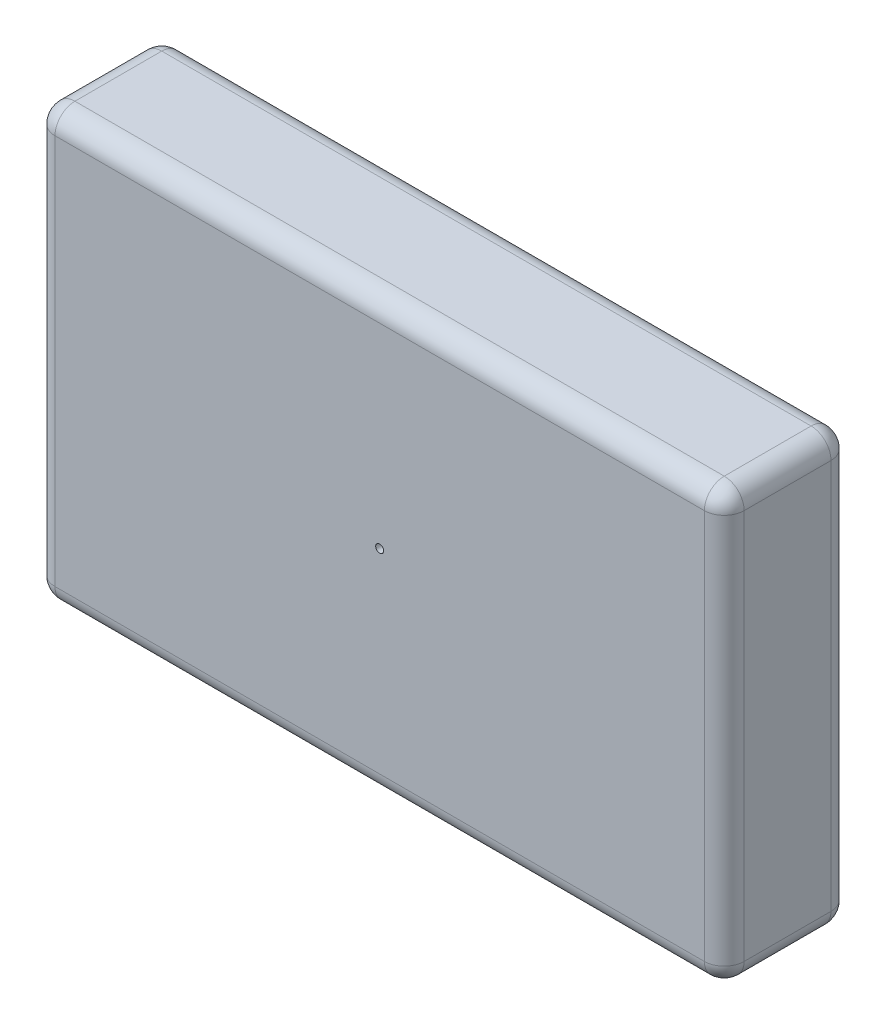
ISO-10303-21;
HEADER;
FILE_DESCRIPTION(('STEP AP214'),'2;1');
FILE_NAME('part.step','',(''),(''),'','','');
FILE_SCHEMA(('AUTOMOTIVE_DESIGN { 1 0 10303 214 1 1 1 1 }'));
ENDSEC;
DATA;
#1=APPLICATION_CONTEXT('core data for automotive mechanical design processes');
#2=APPLICATION_PROTOCOL_DEFINITION('international standard','automotive_design',2000,#1);
#3=PRODUCT_CONTEXT('',#1,'mechanical');
#4=PRODUCT('Part','Part','',(#3));
#5=PRODUCT_RELATED_PRODUCT_CATEGORY('part','',(#4));
#6=PRODUCT_DEFINITION_FORMATION('','',#4);
#7=PRODUCT_DEFINITION_CONTEXT('part definition',#1,'design');
#8=PRODUCT_DEFINITION('design','',#6,#7);
#9=PRODUCT_DEFINITION_SHAPE('','',#8);
#10=(LENGTH_UNIT() NAMED_UNIT(*) SI_UNIT(.MILLI.,.METRE.));
#11=(NAMED_UNIT(*) PLANE_ANGLE_UNIT() SI_UNIT($,.RADIAN.));
#12=(NAMED_UNIT(*) SI_UNIT($,.STERADIAN.) SOLID_ANGLE_UNIT());
#13=UNCERTAINTY_MEASURE_WITH_UNIT(LENGTH_MEASURE(1.E-05),#10,'distance_accuracy_value','');
#14=(GEOMETRIC_REPRESENTATION_CONTEXT(3) GLOBAL_UNCERTAINTY_ASSIGNED_CONTEXT((#13)) GLOBAL_UNIT_ASSIGNED_CONTEXT((#10,
#11,#12)) REPRESENTATION_CONTEXT('',''));
#15=CARTESIAN_POINT('',(0.,0.,0.));
#16=DIRECTION('',(0.,0.,1.));
#17=DIRECTION('',(1.,0.,0.));
#18=AXIS2_PLACEMENT_3D('',#15,#16,#17);
#19=CARTESIAN_POINT('',(86.5,54.,31.8));
#20=DIRECTION('',(-1.,0.,0.));
#21=DIRECTION('',(0.,0.,1.));
#22=AXIS2_PLACEMENT_3D('',#19,#20,#21);
#23=PLANE('',#22);
#24=DIRECTION('',(0.,1.,0.));
#25=VECTOR('',#24,1.);
#26=CARTESIAN_POINT('',(86.5,-54.,26.8));
#27=LINE('',#26,#25);
#28=CARTESIAN_POINT('',(86.5,49.,26.8));
#29=VERTEX_POINT('',#28);
#30=CARTESIAN_POINT('',(86.5,-49.,26.8));
#31=VERTEX_POINT('',#30);
#32=EDGE_CURVE('E181',#29,#31,#27,.F.);
#33=ORIENTED_EDGE('',*,*,#32,.T.);
#34=DIRECTION('',(0.,0.,-1.));
#35=VECTOR('',#34,1.);
#36=CARTESIAN_POINT('',(86.5,-49.,31.8));
#37=LINE('',#36,#35);
#38=CARTESIAN_POINT('',(86.5,-49.,5.));
#39=VERTEX_POINT('',#38);
#40=EDGE_CURVE('E240',#31,#39,#37,.T.);
#41=ORIENTED_EDGE('',*,*,#40,.T.);
#42=DIRECTION('',(0.,1.,0.));
#43=VECTOR('',#42,1.);
#44=CARTESIAN_POINT('',(86.5,54.,5.));
#45=LINE('',#44,#43);
#46=CARTESIAN_POINT('',(86.5,49.,5.));
#47=VERTEX_POINT('',#46);
#48=EDGE_CURVE('E154',#39,#47,#45,.T.);
#49=ORIENTED_EDGE('',*,*,#48,.T.);
#50=DIRECTION('',(0.,0.,-1.));
#51=VECTOR('',#50,1.);
#52=CARTESIAN_POINT('',(86.5,49.,31.8));
#53=LINE('',#52,#51);
#54=EDGE_CURVE('E238',#47,#29,#53,.F.);
#55=ORIENTED_EDGE('',*,*,#54,.T.);
#56=EDGE_LOOP('',(#33,#41,#49,#55));
#57=FACE_BOUND('',#56,.T.);
#58=ADVANCED_FACE('F39',(#57),#23,.F.);
#59=CARTESIAN_POINT('',(-86.5,54.,31.8));
#60=DIRECTION('',(0.,-1.,0.));
#61=DIRECTION('',(0.,0.,-1.));
#62=AXIS2_PLACEMENT_3D('',#59,#60,#61);
#63=PLANE('',#62);
#64=DIRECTION('',(-1.,0.,0.));
#65=VECTOR('',#64,1.);
#66=CARTESIAN_POINT('',(-86.5,54.,5.));
#67=LINE('',#66,#65);
#68=CARTESIAN_POINT('',(81.5,54.,5.));
#69=VERTEX_POINT('',#68);
#70=CARTESIAN_POINT('',(-81.5,54.,5.));
#71=VERTEX_POINT('',#70);
#72=EDGE_CURVE('E183',#69,#71,#67,.T.);
#73=ORIENTED_EDGE('',*,*,#72,.T.);
#74=DIRECTION('',(0.,0.,-1.));
#75=VECTOR('',#74,1.);
#76=CARTESIAN_POINT('',(-81.5,54.,31.8));
#77=LINE('',#76,#75);
#78=CARTESIAN_POINT('',(-81.5,54.,26.8));
#79=VERTEX_POINT('',#78);
#80=EDGE_CURVE('E11',#71,#79,#77,.F.);
#81=ORIENTED_EDGE('',*,*,#80,.T.);
#82=DIRECTION('',(-1.,0.,0.));
#83=VECTOR('',#82,1.);
#84=CARTESIAN_POINT('',(86.5,54.,26.8));
#85=LINE('',#84,#83);
#86=CARTESIAN_POINT('',(81.5,54.,26.8));
#87=VERTEX_POINT('',#86);
#88=EDGE_CURVE('E179',#79,#87,#85,.F.);
#89=ORIENTED_EDGE('',*,*,#88,.T.);
#90=DIRECTION('',(0.,0.,-1.));
#91=VECTOR('',#90,1.);
#92=CARTESIAN_POINT('',(81.5,54.,31.8));
#93=LINE('',#92,#91);
#94=EDGE_CURVE('E48',#87,#69,#93,.T.);
#95=ORIENTED_EDGE('',*,*,#94,.T.);
#96=EDGE_LOOP('',(#73,#81,#89,#95));
#97=FACE_BOUND('',#96,.T.);
#98=ADVANCED_FACE('F295',(#97),#63,.F.);
#99=CARTESIAN_POINT('',(-86.5,54.,31.8));
#100=DIRECTION('',(1.,0.,0.));
#101=DIRECTION('',(0.,1.,0.));
#102=AXIS2_PLACEMENT_3D('',#99,#100,#101);
#103=PLANE('',#102);
#104=DIRECTION('',(0.,-1.,0.));
#105=VECTOR('',#104,1.);
#106=CARTESIAN_POINT('',(-86.5,54.,5.));
#107=LINE('',#106,#105);
#108=CARTESIAN_POINT('',(-86.5,49.,5.));
#109=VERTEX_POINT('',#108);
#110=CARTESIAN_POINT('',(-86.5,-49.,5.));
#111=VERTEX_POINT('',#110);
#112=EDGE_CURVE('E197',#109,#111,#107,.T.);
#113=ORIENTED_EDGE('',*,*,#112,.T.);
#114=DIRECTION('',(0.,0.,-1.));
#115=VECTOR('',#114,1.);
#116=CARTESIAN_POINT('',(-86.5,-49.,31.8));
#117=LINE('',#116,#115);
#118=CARTESIAN_POINT('',(-86.5,-49.,26.8));
#119=VERTEX_POINT('',#118);
#120=EDGE_CURVE('E236',#111,#119,#117,.F.);
#121=ORIENTED_EDGE('',*,*,#120,.T.);
#122=DIRECTION('',(0.,-1.,0.));
#123=VECTOR('',#122,1.);
#124=CARTESIAN_POINT('',(-86.5,54.,26.8));
#125=LINE('',#124,#123);
#126=CARTESIAN_POINT('',(-86.5,49.,26.8));
#127=VERTEX_POINT('',#126);
#128=EDGE_CURVE('E172',#119,#127,#125,.F.);
#129=ORIENTED_EDGE('',*,*,#128,.T.);
#130=DIRECTION('',(0.,0.,-1.));
#131=VECTOR('',#130,1.);
#132=CARTESIAN_POINT('',(-86.5,49.,31.8));
#133=LINE('',#132,#131);
#134=EDGE_CURVE('E234',#127,#109,#133,.T.);
#135=ORIENTED_EDGE('',*,*,#134,.T.);
#136=EDGE_LOOP('',(#113,#121,#129,#135));
#137=FACE_BOUND('',#136,.T.);
#138=ADVANCED_FACE('F285',(#137),#103,.F.);
#139=CARTESIAN_POINT('',(-86.5,-54.,31.8));
#140=DIRECTION('',(0.,1.,0.));
#141=DIRECTION('',(0.,0.,1.));
#142=AXIS2_PLACEMENT_3D('',#139,#140,#141);
#143=PLANE('',#142);
#144=DIRECTION('',(1.,0.,0.));
#145=VECTOR('',#144,1.);
#146=CARTESIAN_POINT('',(-86.5,-54.,26.8));
#147=LINE('',#146,#145);
#148=CARTESIAN_POINT('',(81.5,-54.,26.8));
#149=VERTEX_POINT('',#148);
#150=CARTESIAN_POINT('',(-81.5,-54.,26.8));
#151=VERTEX_POINT('',#150);
#152=EDGE_CURVE('E152',#149,#151,#147,.F.);
#153=ORIENTED_EDGE('',*,*,#152,.T.);
#154=DIRECTION('',(0.,0.,-1.));
#155=VECTOR('',#154,1.);
#156=CARTESIAN_POINT('',(-81.5,-54.,31.8));
#157=LINE('',#156,#155);
#158=CARTESIAN_POINT('',(-81.5,-54.,5.));
#159=VERTEX_POINT('',#158);
#160=EDGE_CURVE('E232',#151,#159,#157,.T.);
#161=ORIENTED_EDGE('',*,*,#160,.T.);
#162=DIRECTION('',(1.,0.,0.));
#163=VECTOR('',#162,1.);
#164=CARTESIAN_POINT('',(-86.5,-54.,5.));
#165=LINE('',#164,#163);
#166=CARTESIAN_POINT('',(81.5,-54.,5.));
#167=VERTEX_POINT('',#166);
#168=EDGE_CURVE('E200',#159,#167,#165,.T.);
#169=ORIENTED_EDGE('',*,*,#168,.T.);
#170=DIRECTION('',(0.,0.,-1.));
#171=VECTOR('',#170,1.);
#172=CARTESIAN_POINT('',(81.5,-54.,31.8));
#173=LINE('',#172,#171);
#174=EDGE_CURVE('E230',#167,#149,#173,.F.);
#175=ORIENTED_EDGE('',*,*,#174,.T.);
#176=EDGE_LOOP('',(#153,#161,#169,#175));
#177=FACE_BOUND('',#176,.T.);
#178=ADVANCED_FACE('F412',(#177),#143,.F.);
#179=CARTESIAN_POINT('',(0.,0.,31.8));
#180=DIRECTION('',(0.,0.,1.));
#181=DIRECTION('',(1.,0.,0.));
#182=AXIS2_PLACEMENT_3D('',#179,#180,#181);
#183=PLANE('',#182);
#184=CARTESIAN_POINT('',(0.,0.,31.8));
#185=DIRECTION('',(0.,0.,1.));
#186=DIRECTION('',(1.,0.,0.));
#187=AXIS2_PLACEMENT_3D('',#184,#185,#186);
#188=CIRCLE('',#187,1.);
#189=CARTESIAN_POINT('',(1.,0.,31.8));
#190=VERTEX_POINT('',#189);
#191=EDGE_CURVE('E262',#190,#190,#188,.T.);
#192=ORIENTED_EDGE('',*,*,#191,.F.);
#193=EDGE_LOOP('',(#192));
#194=FACE_BOUND('',#193,.T.);
#195=DIRECTION('',(0.,-1.,0.));
#196=VECTOR('',#195,1.);
#197=CARTESIAN_POINT('',(-81.5,-54.,31.8));
#198=LINE('',#197,#196);
#199=CARTESIAN_POINT('',(-81.5,49.,31.8));
#200=VERTEX_POINT('',#199);
#201=CARTESIAN_POINT('',(-81.5,-49.,31.8));
#202=VERTEX_POINT('',#201);
#203=EDGE_CURVE('E170',#200,#202,#198,.T.);
#204=ORIENTED_EDGE('',*,*,#203,.T.);
#205=DIRECTION('',(1.,0.,0.));
#206=VECTOR('',#205,1.);
#207=CARTESIAN_POINT('',(86.5,-49.,31.8));
#208=LINE('',#207,#206);
#209=CARTESIAN_POINT('',(81.5,-49.,31.8));
#210=VERTEX_POINT('',#209);
#211=EDGE_CURVE('E149',#202,#210,#208,.T.);
#212=ORIENTED_EDGE('',*,*,#211,.T.);
#213=DIRECTION('',(0.,1.,0.));
#214=VECTOR('',#213,1.);
#215=CARTESIAN_POINT('',(81.5,54.,31.8));
#216=LINE('',#215,#214);
#217=CARTESIAN_POINT('',(81.5,49.,31.8));
#218=VERTEX_POINT('',#217);
#219=EDGE_CURVE('E158',#210,#218,#216,.T.);
#220=ORIENTED_EDGE('',*,*,#219,.T.);
#221=DIRECTION('',(-1.,0.,0.));
#222=VECTOR('',#221,1.);
#223=CARTESIAN_POINT('',(-86.5,49.,31.8));
#224=LINE('',#223,#222);
#225=EDGE_CURVE('E164',#218,#200,#224,.T.);
#226=ORIENTED_EDGE('',*,*,#225,.T.);
#227=EDGE_LOOP('',(#204,#212,#220,#226));
#228=FACE_BOUND('',#227,.T.);
#229=ADVANCED_FACE('F168',(#194,#228),#183,.T.);
#230=CARTESIAN_POINT('',(0.,0.,0.));
#231=DIRECTION('',(0.,0.,1.));
#232=DIRECTION('',(1.,0.,0.));
#233=AXIS2_PLACEMENT_3D('',#230,#231,#232);
#234=PLANE('',#233);
#235=DIRECTION('',(0.,-1.,0.));
#236=VECTOR('',#235,1.);
#237=CARTESIAN_POINT('',(-81.5,0.,0.));
#238=LINE('',#237,#236);
#239=CARTESIAN_POINT('',(-81.5,-49.,0.));
#240=VERTEX_POINT('',#239);
#241=CARTESIAN_POINT('',(-81.5,49.,0.));
#242=VERTEX_POINT('',#241);
#243=EDGE_CURVE('E191',#240,#242,#238,.F.);
#244=ORIENTED_EDGE('',*,*,#243,.T.);
#245=DIRECTION('',(-1.,0.,0.));
#246=VECTOR('',#245,1.);
#247=CARTESIAN_POINT('',(0.,49.,0.));
#248=LINE('',#247,#246);
#249=CARTESIAN_POINT('',(81.5,49.,0.));
#250=VERTEX_POINT('',#249);
#251=EDGE_CURVE('E194',#242,#250,#248,.F.);
#252=ORIENTED_EDGE('',*,*,#251,.T.);
#253=DIRECTION('',(0.,1.,0.));
#254=VECTOR('',#253,1.);
#255=CARTESIAN_POINT('',(81.5,0.,0.));
#256=LINE('',#255,#254);
#257=CARTESIAN_POINT('',(81.5,-49.,0.));
#258=VERTEX_POINT('',#257);
#259=EDGE_CURVE('E185',#250,#258,#256,.F.);
#260=ORIENTED_EDGE('',*,*,#259,.T.);
#261=DIRECTION('',(1.,0.,0.));
#262=VECTOR('',#261,1.);
#263=CARTESIAN_POINT('',(0.,-49.,0.));
#264=LINE('',#263,#262);
#265=EDGE_CURVE('E188',#258,#240,#264,.F.);
#266=ORIENTED_EDGE('',*,*,#265,.T.);
#267=EDGE_LOOP('',(#244,#252,#260,#266));
#268=FACE_BOUND('',#267,.T.);
#269=ADVANCED_FACE('F330',(#268),#234,.F.);
#270=CARTESIAN_POINT('',(0.,49.,26.8));
#271=DIRECTION('',(1.,0.,0.));
#272=DIRECTION('',(0.,0.,-1.));
#273=AXIS2_PLACEMENT_3D('',#270,#271,#272);
#274=CYLINDRICAL_SURFACE('',#273,5.);
#275=ORIENTED_EDGE('',*,*,#88,.F.);
#276=CARTESIAN_POINT('',(-81.5,49.,26.8));
#277=DIRECTION('',(1.,0.,0.));
#278=DIRECTION('',(0.,0.,-1.));
#279=AXIS2_PLACEMENT_3D('',#276,#277,#278);
#280=CIRCLE('',#279,5.);
#281=EDGE_CURVE('E225',#79,#200,#280,.T.);
#282=ORIENTED_EDGE('',*,*,#281,.T.);
#283=ORIENTED_EDGE('',*,*,#225,.F.);
#284=CARTESIAN_POINT('',(81.5,49.,26.8));
#285=DIRECTION('',(1.,0.,0.));
#286=DIRECTION('',(0.,0.,-1.));
#287=AXIS2_PLACEMENT_3D('',#284,#285,#286);
#288=CIRCLE('',#287,5.);
#289=EDGE_CURVE('E223',#218,#87,#288,.F.);
#290=ORIENTED_EDGE('',*,*,#289,.T.);
#291=EDGE_LOOP('',(#275,#282,#283,#290));
#292=FACE_BOUND('',#291,.T.);
#293=ADVANCED_FACE('F296',(#292),#274,.T.);
#294=CARTESIAN_POINT('',(-81.5,0.,26.8));
#295=DIRECTION('',(0.,1.,0.));
#296=DIRECTION('',(-1.,0.,0.));
#297=AXIS2_PLACEMENT_3D('',#294,#295,#296);
#298=CYLINDRICAL_SURFACE('',#297,5.);
#299=ORIENTED_EDGE('',*,*,#128,.F.);
#300=CARTESIAN_POINT('',(-81.5,-49.,26.8));
#301=DIRECTION('',(0.,1.,0.));
#302=DIRECTION('',(-1.,0.,0.));
#303=AXIS2_PLACEMENT_3D('',#300,#301,#302);
#304=CIRCLE('',#303,5.);
#305=EDGE_CURVE('E209',#119,#202,#304,.T.);
#306=ORIENTED_EDGE('',*,*,#305,.T.);
#307=ORIENTED_EDGE('',*,*,#203,.F.);
#308=CARTESIAN_POINT('',(-81.5,49.,26.8));
#309=DIRECTION('',(0.,1.,0.));
#310=DIRECTION('',(-1.,0.,0.));
#311=AXIS2_PLACEMENT_3D('',#308,#309,#310);
#312=CIRCLE('',#311,5.);
#313=EDGE_CURVE('E206',#200,#127,#312,.F.);
#314=ORIENTED_EDGE('',*,*,#313,.T.);
#315=EDGE_LOOP('',(#299,#306,#307,#314));
#316=FACE_BOUND('',#315,.T.);
#317=ADVANCED_FACE('F272',(#316),#298,.T.);
#318=CARTESIAN_POINT('',(81.5,0.,26.8));
#319=DIRECTION('',(0.,-1.,0.));
#320=DIRECTION('',(0.,0.,-1.));
#321=AXIS2_PLACEMENT_3D('',#318,#319,#320);
#322=CYLINDRICAL_SURFACE('',#321,5.);
#323=ORIENTED_EDGE('',*,*,#219,.F.);
#324=CARTESIAN_POINT('',(81.5,-49.,26.8));
#325=DIRECTION('',(0.,-1.,0.));
#326=DIRECTION('',(0.,0.,-1.));
#327=AXIS2_PLACEMENT_3D('',#324,#325,#326);
#328=CIRCLE('',#327,5.);
#329=EDGE_CURVE('E130',#210,#31,#328,.F.);
#330=ORIENTED_EDGE('',*,*,#329,.T.);
#331=ORIENTED_EDGE('',*,*,#32,.F.);
#332=CARTESIAN_POINT('',(81.5,49.,26.8));
#333=DIRECTION('',(0.,-1.,0.));
#334=DIRECTION('',(0.,0.,-1.));
#335=AXIS2_PLACEMENT_3D('',#332,#333,#334);
#336=CIRCLE('',#335,5.);
#337=EDGE_CURVE('E141',#29,#218,#336,.T.);
#338=ORIENTED_EDGE('',*,*,#337,.T.);
#339=EDGE_LOOP('',(#323,#330,#331,#338));
#340=FACE_BOUND('',#339,.T.);
#341=ADVANCED_FACE('F159',(#340),#322,.T.);
#342=CARTESIAN_POINT('',(0.,-49.,26.8));
#343=DIRECTION('',(-1.,0.,0.));
#344=DIRECTION('',(0.,0.,1.));
#345=AXIS2_PLACEMENT_3D('',#342,#343,#344);
#346=CYLINDRICAL_SURFACE('',#345,5.);
#347=ORIENTED_EDGE('',*,*,#211,.F.);
#348=CARTESIAN_POINT('',(-81.5,-49.,26.8));
#349=DIRECTION('',(-1.,0.,0.));
#350=DIRECTION('',(0.,0.,1.));
#351=AXIS2_PLACEMENT_3D('',#348,#349,#350);
#352=CIRCLE('',#351,5.);
#353=EDGE_CURVE('E153',#202,#151,#352,.F.);
#354=ORIENTED_EDGE('',*,*,#353,.T.);
#355=ORIENTED_EDGE('',*,*,#152,.F.);
#356=CARTESIAN_POINT('',(81.5,-49.,26.8));
#357=DIRECTION('',(-1.,0.,0.));
#358=DIRECTION('',(0.,0.,1.));
#359=AXIS2_PLACEMENT_3D('',#356,#357,#358);
#360=CIRCLE('',#359,5.);
#361=EDGE_CURVE('E133',#149,#210,#360,.T.);
#362=ORIENTED_EDGE('',*,*,#361,.T.);
#363=EDGE_LOOP('',(#347,#354,#355,#362));
#364=FACE_BOUND('',#363,.T.);
#365=ADVANCED_FACE('F146',(#364),#346,.T.);
#366=CARTESIAN_POINT('',(-86.5,-49.,5.));
#367=DIRECTION('',(1.,0.,0.));
#368=DIRECTION('',(0.,0.,-1.));
#369=AXIS2_PLACEMENT_3D('',#366,#367,#368);
#370=CYLINDRICAL_SURFACE('',#369,5.);
#371=ORIENTED_EDGE('',*,*,#168,.F.);
#372=CARTESIAN_POINT('',(-81.5,-49.,5.));
#373=DIRECTION('',(1.,0.,0.));
#374=DIRECTION('',(0.,0.,-1.));
#375=AXIS2_PLACEMENT_3D('',#372,#373,#374);
#376=CIRCLE('',#375,5.);
#377=EDGE_CURVE('E217',#159,#240,#376,.T.);
#378=ORIENTED_EDGE('',*,*,#377,.T.);
#379=ORIENTED_EDGE('',*,*,#265,.F.);
#380=CARTESIAN_POINT('',(81.5,-49.,5.));
#381=DIRECTION('',(1.,0.,0.));
#382=DIRECTION('',(0.,0.,-1.));
#383=AXIS2_PLACEMENT_3D('',#380,#381,#382);
#384=CIRCLE('',#383,5.);
#385=EDGE_CURVE('E215',#258,#167,#384,.F.);
#386=ORIENTED_EDGE('',*,*,#385,.T.);
#387=EDGE_LOOP('',(#371,#378,#379,#386));
#388=FACE_BOUND('',#387,.T.);
#389=ADVANCED_FACE('F323',(#388),#370,.T.);
#390=CARTESIAN_POINT('',(81.5,54.,5.));
#391=DIRECTION('',(0.,1.,0.));
#392=DIRECTION('',(0.,0.,1.));
#393=AXIS2_PLACEMENT_3D('',#390,#391,#392);
#394=CYLINDRICAL_SURFACE('',#393,5.);
#395=ORIENTED_EDGE('',*,*,#48,.F.);
#396=CARTESIAN_POINT('',(81.5,-49.,5.));
#397=DIRECTION('',(0.,1.,0.));
#398=DIRECTION('',(0.,0.,1.));
#399=AXIS2_PLACEMENT_3D('',#396,#397,#398);
#400=CIRCLE('',#399,5.);
#401=EDGE_CURVE('E221',#39,#258,#400,.T.);
#402=ORIENTED_EDGE('',*,*,#401,.T.);
#403=ORIENTED_EDGE('',*,*,#259,.F.);
#404=CARTESIAN_POINT('',(81.5,49.,5.));
#405=DIRECTION('',(0.,1.,0.));
#406=DIRECTION('',(0.,0.,1.));
#407=AXIS2_PLACEMENT_3D('',#404,#405,#406);
#408=CIRCLE('',#407,5.);
#409=EDGE_CURVE('E140',#250,#47,#408,.F.);
#410=ORIENTED_EDGE('',*,*,#409,.T.);
#411=EDGE_LOOP('',(#395,#402,#403,#410));
#412=FACE_BOUND('',#411,.T.);
#413=ADVANCED_FACE('F337',(#412),#394,.T.);
#414=CARTESIAN_POINT('',(-81.5,54.,5.));
#415=DIRECTION('',(0.,-1.,0.));
#416=DIRECTION('',(1.,0.,0.));
#417=AXIS2_PLACEMENT_3D('',#414,#415,#416);
#418=CYLINDRICAL_SURFACE('',#417,5.);
#419=ORIENTED_EDGE('',*,*,#243,.F.);
#420=CARTESIAN_POINT('',(-81.5,-49.,5.));
#421=DIRECTION('',(0.,-1.,0.));
#422=DIRECTION('',(1.,0.,0.));
#423=AXIS2_PLACEMENT_3D('',#420,#421,#422);
#424=CIRCLE('',#423,5.);
#425=EDGE_CURVE('E213',#240,#111,#424,.F.);
#426=ORIENTED_EDGE('',*,*,#425,.T.);
#427=ORIENTED_EDGE('',*,*,#112,.F.);
#428=CARTESIAN_POINT('',(-81.5,49.,5.));
#429=DIRECTION('',(0.,-1.,0.));
#430=DIRECTION('',(1.,0.,0.));
#431=AXIS2_PLACEMENT_3D('',#428,#429,#430);
#432=CIRCLE('',#431,5.);
#433=EDGE_CURVE('E211',#109,#242,#432,.T.);
#434=ORIENTED_EDGE('',*,*,#433,.T.);
#435=EDGE_LOOP('',(#419,#426,#427,#434));
#436=FACE_BOUND('',#435,.T.);
#437=ADVANCED_FACE('F290',(#436),#418,.T.);
#438=CARTESIAN_POINT('',(-86.5,49.,5.));
#439=DIRECTION('',(-1.,0.,0.));
#440=DIRECTION('',(0.,0.,1.));
#441=AXIS2_PLACEMENT_3D('',#438,#439,#440);
#442=CYLINDRICAL_SURFACE('',#441,5.);
#443=ORIENTED_EDGE('',*,*,#251,.F.);
#444=CARTESIAN_POINT('',(-81.5,49.,5.));
#445=DIRECTION('',(-1.,0.,0.));
#446=DIRECTION('',(0.,0.,1.));
#447=AXIS2_PLACEMENT_3D('',#444,#445,#446);
#448=CIRCLE('',#447,5.);
#449=EDGE_CURVE('E56',#242,#71,#448,.F.);
#450=ORIENTED_EDGE('',*,*,#449,.T.);
#451=ORIENTED_EDGE('',*,*,#72,.F.);
#452=CARTESIAN_POINT('',(81.5,49.,5.));
#453=DIRECTION('',(-1.,0.,0.));
#454=DIRECTION('',(0.,0.,1.));
#455=AXIS2_PLACEMENT_3D('',#452,#453,#454);
#456=CIRCLE('',#455,5.);
#457=EDGE_CURVE('E227',#69,#250,#456,.T.);
#458=ORIENTED_EDGE('',*,*,#457,.T.);
#459=EDGE_LOOP('',(#443,#450,#451,#458));
#460=FACE_BOUND('',#459,.T.);
#461=ADVANCED_FACE('F331',(#460),#442,.T.);
#462=CARTESIAN_POINT('',(-81.5,-49.,5.));
#463=DIRECTION('',(0.,0.,1.));
#464=DIRECTION('',(1.,0.,0.));
#465=AXIS2_PLACEMENT_3D('',#462,#463,#464);
#466=SPHERICAL_SURFACE('',#465,5.);
#467=ORIENTED_EDGE('',*,*,#425,.F.);
#468=ORIENTED_EDGE('',*,*,#377,.F.);
#469=CARTESIAN_POINT('',(-81.5,-49.,5.));
#470=DIRECTION('',(0.,0.,1.));
#471=DIRECTION('',(1.,0.,0.));
#472=AXIS2_PLACEMENT_3D('',#469,#470,#471);
#473=CIRCLE('',#472,5.);
#474=EDGE_CURVE('E165',#111,#159,#473,.T.);
#475=ORIENTED_EDGE('',*,*,#474,.F.);
#476=EDGE_LOOP('',(#467,#468,#475));
#477=FACE_BOUND('',#476,.T.);
#478=ADVANCED_FACE('F334',(#477),#466,.T.);
#479=CARTESIAN_POINT('',(-81.5,-49.,31.8));
#480=DIRECTION('',(0.,0.,-1.));
#481=DIRECTION('',(-1.,0.,0.));
#482=AXIS2_PLACEMENT_3D('',#479,#480,#481);
#483=CYLINDRICAL_SURFACE('',#482,5.);
#484=ORIENTED_EDGE('',*,*,#474,.T.);
#485=ORIENTED_EDGE('',*,*,#160,.F.);
#486=CARTESIAN_POINT('',(-81.5,-49.,26.8));
#487=DIRECTION('',(0.,0.,1.));
#488=DIRECTION('',(1.,0.,0.));
#489=AXIS2_PLACEMENT_3D('',#486,#487,#488);
#490=CIRCLE('',#489,5.);
#491=EDGE_CURVE('E243',#119,#151,#490,.T.);
#492=ORIENTED_EDGE('',*,*,#491,.F.);
#493=ORIENTED_EDGE('',*,*,#120,.F.);
#494=EDGE_LOOP('',(#484,#485,#492,#493));
#495=FACE_BOUND('',#494,.T.);
#496=ADVANCED_FACE('F348',(#495),#483,.T.);
#497=CARTESIAN_POINT('',(-81.5,-49.,26.8));
#498=DIRECTION('',(0.,0.,1.));
#499=DIRECTION('',(1.,0.,0.));
#500=AXIS2_PLACEMENT_3D('',#497,#498,#499);
#501=SPHERICAL_SURFACE('',#500,5.);
#502=ORIENTED_EDGE('',*,*,#353,.F.);
#503=ORIENTED_EDGE('',*,*,#305,.F.);
#504=ORIENTED_EDGE('',*,*,#491,.T.);
#505=EDGE_LOOP('',(#502,#503,#504));
#506=FACE_BOUND('',#505,.T.);
#507=ADVANCED_FACE('F344',(#506),#501,.T.);
#508=CARTESIAN_POINT('',(81.5,-49.,5.));
#509=DIRECTION('',(0.,0.,1.));
#510=DIRECTION('',(1.,0.,0.));
#511=AXIS2_PLACEMENT_3D('',#508,#509,#510);
#512=SPHERICAL_SURFACE('',#511,5.);
#513=ORIENTED_EDGE('',*,*,#385,.F.);
#514=ORIENTED_EDGE('',*,*,#401,.F.);
#515=CARTESIAN_POINT('',(81.5,-49.,5.));
#516=DIRECTION('',(0.,0.,1.));
#517=DIRECTION('',(1.,0.,0.));
#518=AXIS2_PLACEMENT_3D('',#515,#516,#517);
#519=CIRCLE('',#518,5.);
#520=EDGE_CURVE('E245',#167,#39,#519,.T.);
#521=ORIENTED_EDGE('',*,*,#520,.F.);
#522=EDGE_LOOP('',(#513,#514,#521));
#523=FACE_BOUND('',#522,.T.);
#524=ADVANCED_FACE('F347',(#523),#512,.T.);
#525=CARTESIAN_POINT('',(81.5,-49.,31.8));
#526=DIRECTION('',(0.,0.,-1.));
#527=DIRECTION('',(-1.,0.,0.));
#528=AXIS2_PLACEMENT_3D('',#525,#526,#527);
#529=CYLINDRICAL_SURFACE('',#528,5.);
#530=ORIENTED_EDGE('',*,*,#520,.T.);
#531=ORIENTED_EDGE('',*,*,#40,.F.);
#532=CARTESIAN_POINT('',(81.5,-49.,26.8));
#533=DIRECTION('',(0.,0.,1.));
#534=DIRECTION('',(1.,0.,0.));
#535=AXIS2_PLACEMENT_3D('',#532,#533,#534);
#536=CIRCLE('',#535,5.);
#537=EDGE_CURVE('E135',#149,#31,#536,.T.);
#538=ORIENTED_EDGE('',*,*,#537,.F.);
#539=ORIENTED_EDGE('',*,*,#174,.F.);
#540=EDGE_LOOP('',(#530,#531,#538,#539));
#541=FACE_BOUND('',#540,.T.);
#542=ADVANCED_FACE('F358',(#541),#529,.T.);
#543=CARTESIAN_POINT('',(81.5,-49.,26.8));
#544=DIRECTION('',(0.,0.,1.));
#545=DIRECTION('',(1.,0.,0.));
#546=AXIS2_PLACEMENT_3D('',#543,#544,#545);
#547=SPHERICAL_SURFACE('',#546,5.);
#548=ORIENTED_EDGE('',*,*,#537,.T.);
#549=ORIENTED_EDGE('',*,*,#329,.F.);
#550=ORIENTED_EDGE('',*,*,#361,.F.);
#551=EDGE_LOOP('',(#548,#549,#550));
#552=FACE_BOUND('',#551,.T.);
#553=ADVANCED_FACE('F132',(#552),#547,.T.);
#554=CARTESIAN_POINT('',(-81.5,49.,5.));
#555=DIRECTION('',(0.,0.,1.));
#556=DIRECTION('',(1.,0.,0.));
#557=AXIS2_PLACEMENT_3D('',#554,#555,#556);
#558=SPHERICAL_SURFACE('',#557,5.);
#559=ORIENTED_EDGE('',*,*,#449,.F.);
#560=ORIENTED_EDGE('',*,*,#433,.F.);
#561=CARTESIAN_POINT('',(-81.5,49.,5.));
#562=DIRECTION('',(0.,0.,1.));
#563=DIRECTION('',(1.,0.,0.));
#564=AXIS2_PLACEMENT_3D('',#561,#562,#563);
#565=CIRCLE('',#564,5.);
#566=EDGE_CURVE('E249',#71,#109,#565,.T.);
#567=ORIENTED_EDGE('',*,*,#566,.F.);
#568=EDGE_LOOP('',(#559,#560,#567));
#569=FACE_BOUND('',#568,.T.);
#570=ADVANCED_FACE('F293',(#569),#558,.T.);
#571=CARTESIAN_POINT('',(-81.5,49.,31.8));
#572=DIRECTION('',(0.,0.,-1.));
#573=DIRECTION('',(-1.,0.,0.));
#574=AXIS2_PLACEMENT_3D('',#571,#572,#573);
#575=CYLINDRICAL_SURFACE('',#574,5.);
#576=ORIENTED_EDGE('',*,*,#566,.T.);
#577=ORIENTED_EDGE('',*,*,#134,.F.);
#578=CARTESIAN_POINT('',(-81.5,49.,26.8));
#579=DIRECTION('',(0.,0.,1.));
#580=DIRECTION('',(1.,0.,0.));
#581=AXIS2_PLACEMENT_3D('',#578,#579,#580);
#582=CIRCLE('',#581,5.);
#583=EDGE_CURVE('E252',#79,#127,#582,.T.);
#584=ORIENTED_EDGE('',*,*,#583,.F.);
#585=ORIENTED_EDGE('',*,*,#80,.F.);
#586=EDGE_LOOP('',(#576,#577,#584,#585));
#587=FACE_BOUND('',#586,.T.);
#588=ADVANCED_FACE('F281',(#587),#575,.T.);
#589=CARTESIAN_POINT('',(-81.5,49.,26.8));
#590=DIRECTION('',(0.,0.,1.));
#591=DIRECTION('',(1.,0.,0.));
#592=AXIS2_PLACEMENT_3D('',#589,#590,#591);
#593=SPHERICAL_SURFACE('',#592,5.);
#594=ORIENTED_EDGE('',*,*,#313,.F.);
#595=ORIENTED_EDGE('',*,*,#281,.F.);
#596=ORIENTED_EDGE('',*,*,#583,.T.);
#597=EDGE_LOOP('',(#594,#595,#596));
#598=FACE_BOUND('',#597,.T.);
#599=ADVANCED_FACE('F276',(#598),#593,.T.);
#600=CARTESIAN_POINT('',(81.5,49.,5.));
#601=DIRECTION('',(0.,0.,1.));
#602=DIRECTION('',(1.,0.,0.));
#603=AXIS2_PLACEMENT_3D('',#600,#601,#602);
#604=SPHERICAL_SURFACE('',#603,5.);
#605=ORIENTED_EDGE('',*,*,#409,.F.);
#606=ORIENTED_EDGE('',*,*,#457,.F.);
#607=CARTESIAN_POINT('',(81.5,49.,5.));
#608=DIRECTION('',(0.,0.,1.));
#609=DIRECTION('',(1.,0.,0.));
#610=AXIS2_PLACEMENT_3D('',#607,#608,#609);
#611=CIRCLE('',#610,5.);
#612=EDGE_CURVE('E43',#47,#69,#611,.T.);
#613=ORIENTED_EDGE('',*,*,#612,.F.);
#614=EDGE_LOOP('',(#605,#606,#613));
#615=FACE_BOUND('',#614,.T.);
#616=ADVANCED_FACE('F41',(#615),#604,.T.);
#617=CARTESIAN_POINT('',(81.5,49.,31.8));
#618=DIRECTION('',(0.,0.,-1.));
#619=DIRECTION('',(-1.,0.,0.));
#620=AXIS2_PLACEMENT_3D('',#617,#618,#619);
#621=CYLINDRICAL_SURFACE('',#620,5.);
#622=ORIENTED_EDGE('',*,*,#612,.T.);
#623=ORIENTED_EDGE('',*,*,#94,.F.);
#624=CARTESIAN_POINT('',(81.5,49.,26.8));
#625=DIRECTION('',(0.,0.,1.));
#626=DIRECTION('',(1.,0.,0.));
#627=AXIS2_PLACEMENT_3D('',#624,#625,#626);
#628=CIRCLE('',#627,5.);
#629=EDGE_CURVE('E255',#29,#87,#628,.T.);
#630=ORIENTED_EDGE('',*,*,#629,.F.);
#631=ORIENTED_EDGE('',*,*,#54,.F.);
#632=EDGE_LOOP('',(#622,#623,#630,#631));
#633=FACE_BOUND('',#632,.T.);
#634=ADVANCED_FACE('F300',(#633),#621,.T.);
#635=CARTESIAN_POINT('',(81.5,49.,26.8));
#636=DIRECTION('',(0.,0.,1.));
#637=DIRECTION('',(1.,0.,0.));
#638=AXIS2_PLACEMENT_3D('',#635,#636,#637);
#639=SPHERICAL_SURFACE('',#638,5.);
#640=ORIENTED_EDGE('',*,*,#629,.T.);
#641=ORIENTED_EDGE('',*,*,#289,.F.);
#642=ORIENTED_EDGE('',*,*,#337,.F.);
#643=EDGE_LOOP('',(#640,#641,#642));
#644=FACE_BOUND('',#643,.T.);
#645=ADVANCED_FACE('F297',(#644),#639,.T.);
#646=CARTESIAN_POINT('',(0.,0.,21.8));
#647=DIRECTION('',(0.,0.,1.));
#648=DIRECTION('',(1.,0.,0.));
#649=AXIS2_PLACEMENT_3D('',#646,#647,#648);
#650=CYLINDRICAL_SURFACE('',#649,1.);
#651=CARTESIAN_POINT('',(0.,0.,21.8));
#652=DIRECTION('',(0.,0.,1.));
#653=DIRECTION('',(1.,0.,0.));
#654=AXIS2_PLACEMENT_3D('',#651,#652,#653);
#655=CIRCLE('',#654,1.);
#656=CARTESIAN_POINT('',(1.,0.,21.8));
#657=VERTEX_POINT('',#656);
#658=EDGE_CURVE('E257',#657,#657,#655,.T.);
#659=ORIENTED_EDGE('',*,*,#658,.F.);
#660=EDGE_LOOP('',(#659));
#661=FACE_BOUND('',#660,.T.);
#662=ORIENTED_EDGE('',*,*,#191,.T.);
#663=EDGE_LOOP('',(#662));
#664=FACE_BOUND('',#663,.T.);
#665=ADVANCED_FACE('F299',(#661,#664),#650,.F.);
#666=CARTESIAN_POINT('',(0.,0.,21.8));
#667=DIRECTION('',(0.,0.,1.));
#668=DIRECTION('',(1.,0.,0.));
#669=AXIS2_PLACEMENT_3D('',#666,#667,#668);
#670=PLANE('',#669);
#671=ORIENTED_EDGE('',*,*,#658,.T.);
#672=EDGE_LOOP('',(#671));
#673=FACE_BOUND('',#672,.T.);
#674=ADVANCED_FACE('F307',(#673),#670,.T.);
#675=CLOSED_SHELL('',(#58,#98,#138,#178,#229,#269,#293,#317,#341,#365,#389,#413,#437,#461,#478,
#496,#507,#524,#542,#553,#570,#588,#599,#616,#634,#645,#665,#674));
#676=MANIFOLD_SOLID_BREP('B2',#675);
#677=ADVANCED_BREP_SHAPE_REPRESENTATION('',(#18,#676),#14);
#678=SHAPE_DEFINITION_REPRESENTATION(#9,#677);
ENDSEC;
END-ISO-10303-21;
